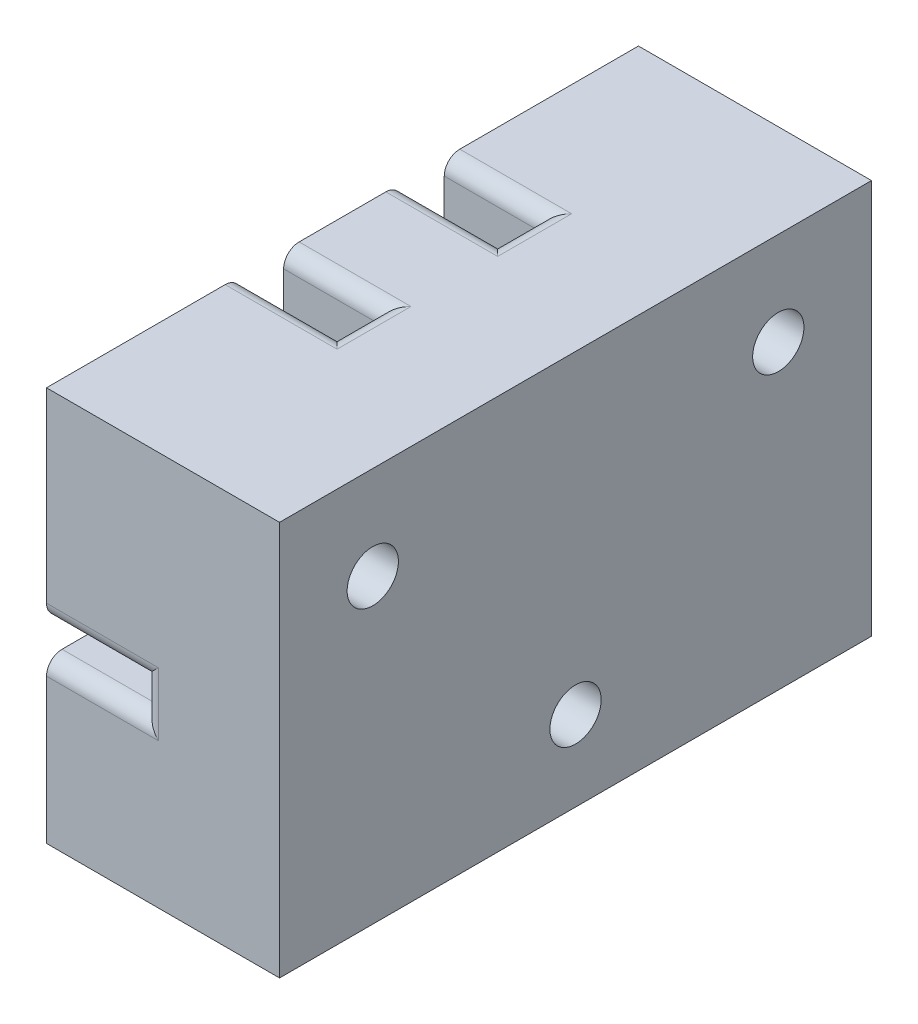
ISO-10303-21;
HEADER;
FILE_DESCRIPTION(('STEP AP214'),'2;1');
FILE_NAME('part.step','',(''),(''),'','','');
FILE_SCHEMA(('AUTOMOTIVE_DESIGN { 1 0 10303 214 1 1 1 1 }'));
ENDSEC;
DATA;
#1=APPLICATION_CONTEXT('core data for automotive mechanical design processes');
#2=APPLICATION_PROTOCOL_DEFINITION('international standard','automotive_design',2000,#1);
#3=PRODUCT_CONTEXT('',#1,'mechanical');
#4=PRODUCT('Part','Part','',(#3));
#5=PRODUCT_RELATED_PRODUCT_CATEGORY('part','',(#4));
#6=PRODUCT_DEFINITION_FORMATION('','',#4);
#7=PRODUCT_DEFINITION_CONTEXT('part definition',#1,'design');
#8=PRODUCT_DEFINITION('design','',#6,#7);
#9=PRODUCT_DEFINITION_SHAPE('','',#8);
#10=(LENGTH_UNIT() NAMED_UNIT(*) SI_UNIT(.MILLI.,.METRE.));
#11=(NAMED_UNIT(*) PLANE_ANGLE_UNIT() SI_UNIT($,.RADIAN.));
#12=(NAMED_UNIT(*) SI_UNIT($,.STERADIAN.) SOLID_ANGLE_UNIT());
#13=UNCERTAINTY_MEASURE_WITH_UNIT(LENGTH_MEASURE(1.E-05),#10,'distance_accuracy_value','');
#14=(GEOMETRIC_REPRESENTATION_CONTEXT(3) GLOBAL_UNCERTAINTY_ASSIGNED_CONTEXT((#13)) GLOBAL_UNIT_ASSIGNED_CONTEXT((#10,
#11,#12)) REPRESENTATION_CONTEXT('',''));
#15=CARTESIAN_POINT('',(0.,0.,0.));
#16=DIRECTION('',(0.,0.,1.));
#17=DIRECTION('',(1.,0.,0.));
#18=AXIS2_PLACEMENT_3D('',#15,#16,#17);
#19=CARTESIAN_POINT('',(0.,0.,0.));
#20=DIRECTION('',(1.,0.,0.));
#21=DIRECTION('',(0.,0.,-1.));
#22=AXIS2_PLACEMENT_3D('',#19,#20,#21);
#23=PLANE('',#22);
#24=CARTESIAN_POINT('',(0.,5.1625,-19.0499999999965));
#25=DIRECTION('',(1.,0.,0.));
#26=DIRECTION('',(0.,0.,-1.));
#27=AXIS2_PLACEMENT_3D('',#24,#25,#26);
#28=CIRCLE('',#27,1.65);
#29=CARTESIAN_POINT('',(0.,5.1625,-20.6999999999965));
#30=VERTEX_POINT('',#29);
#31=EDGE_CURVE('E383',#30,#30,#28,.T.);
#32=ORIENTED_EDGE('',*,*,#31,.T.);
#33=EDGE_LOOP('',(#32));
#34=FACE_BOUND('',#33,.T.);
#35=DIRECTION('',(0.,0.,-1.));
#36=VECTOR('',#35,1.);
#37=CARTESIAN_POINT('',(0.,25.4,0.));
#38=LINE('',#37,#36);
#39=CARTESIAN_POINT('',(0.,25.4,-16.2599999999929));
#40=VERTEX_POINT('',#39);
#41=CARTESIAN_POINT('',(0.,25.4,-21.8400000000071));
#42=VERTEX_POINT('',#41);
#43=EDGE_CURVE('E378',#40,#42,#38,.T.);
#44=ORIENTED_EDGE('',*,*,#43,.T.);
#45=CARTESIAN_POINT('',(0.,24.4,-21.8400000000071));
#46=DIRECTION('',(1.,0.,0.));
#47=DIRECTION('',(0.,0.,-1.));
#48=AXIS2_PLACEMENT_3D('',#45,#46,#47);
#49=CIRCLE('',#48,1.);
#50=CARTESIAN_POINT('',(0.,24.4,-22.8400000000071));
#51=VERTEX_POINT('',#50);
#52=EDGE_CURVE('E505',#42,#51,#49,.F.);
#53=ORIENTED_EDGE('',*,*,#52,.T.);
#54=DIRECTION('',(0.,-1.,0.));
#55=VECTOR('',#54,1.);
#56=CARTESIAN_POINT('',(0.,0.,-22.8400000000071));
#57=LINE('',#56,#55);
#58=CARTESIAN_POINT('',(0.,11.325,-22.8400000000071));
#59=VERTEX_POINT('',#58);
#60=EDGE_CURVE('E630',#51,#59,#57,.T.);
#61=ORIENTED_EDGE('',*,*,#60,.T.);
#62=CARTESIAN_POINT('',(0.,11.325,-23.8400000000071));
#63=DIRECTION('',(1.,0.,0.));
#64=DIRECTION('',(0.,0.,-1.));
#65=AXIS2_PLACEMENT_3D('',#62,#63,#64);
#66=CIRCLE('',#65,1.);
#67=CARTESIAN_POINT('',(0.,10.325,-23.8400000000071));
#68=VERTEX_POINT('',#67);
#69=EDGE_CURVE('E155',#59,#68,#66,.T.);
#70=ORIENTED_EDGE('',*,*,#69,.T.);
#71=DIRECTION('',(0.,0.,-1.));
#72=VECTOR('',#71,1.);
#73=CARTESIAN_POINT('',(0.,10.325,0.));
#74=LINE('',#73,#72);
#75=CARTESIAN_POINT('',(0.,10.325,-37.1));
#76=VERTEX_POINT('',#75);
#77=EDGE_CURVE('E638',#68,#76,#74,.T.);
#78=ORIENTED_EDGE('',*,*,#77,.T.);
#79=CARTESIAN_POINT('',(0.,9.325,-37.1));
#80=DIRECTION('',(1.,0.,0.));
#81=DIRECTION('',(0.,0.,-1.));
#82=AXIS2_PLACEMENT_3D('',#79,#80,#81);
#83=CIRCLE('',#82,1.);
#84=CARTESIAN_POINT('',(0.,9.325,-38.1));
#85=VERTEX_POINT('',#84);
#86=EDGE_CURVE('E491',#76,#85,#83,.F.);
#87=ORIENTED_EDGE('',*,*,#86,.T.);
#88=DIRECTION('',(0.,-1.,0.));
#89=VECTOR('',#88,1.);
#90=CARTESIAN_POINT('',(0.,0.,-38.1));
#91=LINE('',#90,#89);
#92=CARTESIAN_POINT('',(0.,0.,-38.1));
#93=VERTEX_POINT('',#92);
#94=EDGE_CURVE('E397',#85,#93,#91,.T.);
#95=ORIENTED_EDGE('',*,*,#94,.T.);
#96=DIRECTION('',(0.,0.,-1.));
#97=VECTOR('',#96,1.);
#98=CARTESIAN_POINT('',(0.,0.,0.));
#99=LINE('',#98,#97);
#100=CARTESIAN_POINT('',(0.,0.,0.));
#101=VERTEX_POINT('',#100);
#102=EDGE_CURVE('E398',#101,#93,#99,.T.);
#103=ORIENTED_EDGE('',*,*,#102,.F.);
#104=DIRECTION('',(0.,-1.,0.));
#105=VECTOR('',#104,1.);
#106=CARTESIAN_POINT('',(0.,0.,0.));
#107=LINE('',#106,#105);
#108=CARTESIAN_POINT('',(0.,9.325,0.));
#109=VERTEX_POINT('',#108);
#110=EDGE_CURVE('E377',#109,#101,#107,.T.);
#111=ORIENTED_EDGE('',*,*,#110,.F.);
#112=CARTESIAN_POINT('',(0.,9.325,-1.));
#113=DIRECTION('',(1.,0.,0.));
#114=DIRECTION('',(0.,0.,-1.));
#115=AXIS2_PLACEMENT_3D('',#112,#113,#114);
#116=CIRCLE('',#115,1.);
#117=CARTESIAN_POINT('',(0.,10.325,-1.));
#118=VERTEX_POINT('',#117);
#119=EDGE_CURVE('E496',#109,#118,#116,.F.);
#120=ORIENTED_EDGE('',*,*,#119,.T.);
#121=DIRECTION('',(0.,0.,1.));
#122=VECTOR('',#121,1.);
#123=CARTESIAN_POINT('',(0.,10.325,-15.2599999999929));
#124=LINE('',#123,#122);
#125=CARTESIAN_POINT('',(0.,10.325,-14.2599999999929));
#126=VERTEX_POINT('',#125);
#127=EDGE_CURVE('E649',#126,#118,#124,.T.);
#128=ORIENTED_EDGE('',*,*,#127,.F.);
#129=CARTESIAN_POINT('',(0.,11.325,-14.2599999999929));
#130=DIRECTION('',(1.,0.,0.));
#131=DIRECTION('',(0.,0.,-1.));
#132=AXIS2_PLACEMENT_3D('',#129,#130,#131);
#133=CIRCLE('',#132,1.);
#134=CARTESIAN_POINT('',(0.,11.325,-15.2599999999929));
#135=VERTEX_POINT('',#134);
#136=EDGE_CURVE('E557',#126,#135,#133,.T.);
#137=ORIENTED_EDGE('',*,*,#136,.T.);
#138=DIRECTION('',(0.,-1.,0.));
#139=VECTOR('',#138,1.);
#140=CARTESIAN_POINT('',(0.,25.4,-15.2599999999929));
#141=LINE('',#140,#139);
#142=CARTESIAN_POINT('',(0.,24.4,-15.2599999999929));
#143=VERTEX_POINT('',#142);
#144=EDGE_CURVE('E644',#143,#135,#141,.T.);
#145=ORIENTED_EDGE('',*,*,#144,.F.);
#146=CARTESIAN_POINT('',(0.,24.4,-16.2599999999929));
#147=DIRECTION('',(1.,0.,0.));
#148=DIRECTION('',(0.,0.,-1.));
#149=AXIS2_PLACEMENT_3D('',#146,#147,#148);
#150=CIRCLE('',#149,1.);
#151=EDGE_CURVE('E497',#143,#40,#150,.F.);
#152=ORIENTED_EDGE('',*,*,#151,.T.);
#153=EDGE_LOOP('',(#44,#53,#61,#70,#78,#87,#95,#103,#111,#120,#128,#137,#145,#152));
#154=FACE_BOUND('',#153,.T.);
#155=ADVANCED_FACE('F141',(#34,#154),#23,.F.);
#156=CARTESIAN_POINT('',(0.,19.4,-32.1));
#157=DIRECTION('',(1.,0.,0.));
#158=DIRECTION('',(0.,0.,-1.));
#159=AXIS2_PLACEMENT_3D('',#156,#157,#158);
#160=CIRCLE('',#159,1.65);
#161=CARTESIAN_POINT('',(0.,19.4,-33.75));
#162=VERTEX_POINT('',#161);
#163=EDGE_CURVE('E408',#162,#162,#160,.F.);
#164=ORIENTED_EDGE('',*,*,#163,.F.);
#165=EDGE_LOOP('',(#164));
#166=FACE_BOUND('',#165,.T.);
#167=DIRECTION('',(0.,1.,0.));
#168=VECTOR('',#167,1.);
#169=CARTESIAN_POINT('',(0.,0.,-25.6000000000071));
#170=LINE('',#169,#168);
#171=CARTESIAN_POINT('',(0.,13.395,-25.6000000000071));
#172=VERTEX_POINT('',#171);
#173=CARTESIAN_POINT('',(0.,24.4,-25.6000000000071));
#174=VERTEX_POINT('',#173);
#175=EDGE_CURVE('E631',#172,#174,#170,.T.);
#176=ORIENTED_EDGE('',*,*,#175,.T.);
#177=CARTESIAN_POINT('',(0.,24.4,-26.6000000000071));
#178=DIRECTION('',(1.,0.,0.));
#179=DIRECTION('',(0.,0.,-1.));
#180=AXIS2_PLACEMENT_3D('',#177,#178,#179);
#181=CIRCLE('',#180,1.);
#182=CARTESIAN_POINT('',(0.,25.4,-26.6000000000071));
#183=VERTEX_POINT('',#182);
#184=EDGE_CURVE('E489',#174,#183,#181,.F.);
#185=ORIENTED_EDGE('',*,*,#184,.T.);
#186=CARTESIAN_POINT('',(0.,25.4,-38.1));
#187=VERTEX_POINT('',#186);
#188=EDGE_CURVE('E372',#183,#187,#38,.T.);
#189=ORIENTED_EDGE('',*,*,#188,.T.);
#190=CARTESIAN_POINT('',(0.,13.395,-38.1));
#191=VERTEX_POINT('',#190);
#192=EDGE_CURVE('E405',#187,#191,#91,.T.);
#193=ORIENTED_EDGE('',*,*,#192,.T.);
#194=CARTESIAN_POINT('',(0.,13.395,-37.1));
#195=DIRECTION('',(1.,0.,0.));
#196=DIRECTION('',(0.,0.,-1.));
#197=AXIS2_PLACEMENT_3D('',#194,#195,#196);
#198=CIRCLE('',#197,1.);
#199=CARTESIAN_POINT('',(0.,12.395,-37.1));
#200=VERTEX_POINT('',#199);
#201=EDGE_CURVE('E484',#191,#200,#198,.F.);
#202=ORIENTED_EDGE('',*,*,#201,.T.);
#203=DIRECTION('',(0.,0.,1.));
#204=VECTOR('',#203,1.);
#205=CARTESIAN_POINT('',(0.,12.395,0.));
#206=LINE('',#205,#204);
#207=CARTESIAN_POINT('',(0.,12.395,-26.6000000000071));
#208=VERTEX_POINT('',#207);
#209=EDGE_CURVE('E634',#200,#208,#206,.T.);
#210=ORIENTED_EDGE('',*,*,#209,.T.);
#211=CARTESIAN_POINT('',(0.,13.395,-26.6000000000071));
#212=DIRECTION('',(1.,0.,0.));
#213=DIRECTION('',(0.,0.,-1.));
#214=AXIS2_PLACEMENT_3D('',#211,#212,#213);
#215=CIRCLE('',#214,1.);
#216=EDGE_CURVE('E487',#208,#172,#215,.F.);
#217=ORIENTED_EDGE('',*,*,#216,.T.);
#218=EDGE_LOOP('',(#176,#185,#189,#193,#202,#210,#217));
#219=FACE_BOUND('',#218,.T.);
#220=ADVANCED_FACE('F722',(#166,#219),#23,.F.);
#221=CARTESIAN_POINT('',(0.,19.4,-6.));
#222=DIRECTION('',(1.,0.,0.));
#223=DIRECTION('',(0.,0.,-1.));
#224=AXIS2_PLACEMENT_3D('',#221,#222,#223);
#225=CIRCLE('',#224,1.65);
#226=CARTESIAN_POINT('',(0.,19.4,-7.65));
#227=VERTEX_POINT('',#226);
#228=EDGE_CURVE('E369',#227,#227,#225,.T.);
#229=ORIENTED_EDGE('',*,*,#228,.T.);
#230=EDGE_LOOP('',(#229));
#231=FACE_BOUND('',#230,.T.);
#232=CARTESIAN_POINT('',(0.,25.4,0.));
#233=VERTEX_POINT('',#232);
#234=CARTESIAN_POINT('',(0.,25.4,-11.4999999999929));
#235=VERTEX_POINT('',#234);
#236=EDGE_CURVE('E338',#233,#235,#38,.T.);
#237=ORIENTED_EDGE('',*,*,#236,.T.);
#238=CARTESIAN_POINT('',(0.,24.4,-11.4999999999929));
#239=DIRECTION('',(1.,0.,0.));
#240=DIRECTION('',(0.,0.,-1.));
#241=AXIS2_PLACEMENT_3D('',#238,#239,#240);
#242=CIRCLE('',#241,1.);
#243=CARTESIAN_POINT('',(0.,24.4,-12.4999999999929));
#244=VERTEX_POINT('',#243);
#245=EDGE_CURVE('E163',#235,#244,#242,.F.);
#246=ORIENTED_EDGE('',*,*,#245,.T.);
#247=DIRECTION('',(0.,1.,0.));
#248=VECTOR('',#247,1.);
#249=CARTESIAN_POINT('',(0.,12.395,-12.4999999999929));
#250=LINE('',#249,#248);
#251=CARTESIAN_POINT('',(0.,13.395,-12.4999999999929));
#252=VERTEX_POINT('',#251);
#253=EDGE_CURVE('E653',#252,#244,#250,.T.);
#254=ORIENTED_EDGE('',*,*,#253,.F.);
#255=CARTESIAN_POINT('',(0.,13.395,-11.4999999999929));
#256=DIRECTION('',(1.,0.,0.));
#257=DIRECTION('',(0.,0.,-1.));
#258=AXIS2_PLACEMENT_3D('',#255,#256,#257);
#259=CIRCLE('',#258,1.);
#260=CARTESIAN_POINT('',(0.,12.395,-11.4999999999929));
#261=VERTEX_POINT('',#260);
#262=EDGE_CURVE('E169',#252,#261,#259,.F.);
#263=ORIENTED_EDGE('',*,*,#262,.T.);
#264=DIRECTION('',(0.,0.,-1.));
#265=VECTOR('',#264,1.);
#266=CARTESIAN_POINT('',(0.,12.395,7.105427357601E-12));
#267=LINE('',#266,#265);
#268=CARTESIAN_POINT('',(0.,12.395,-1.));
#269=VERTEX_POINT('',#268);
#270=EDGE_CURVE('E646',#269,#261,#267,.T.);
#271=ORIENTED_EDGE('',*,*,#270,.F.);
#272=CARTESIAN_POINT('',(0.,13.395,-1.));
#273=DIRECTION('',(1.,0.,0.));
#274=DIRECTION('',(0.,0.,-1.));
#275=AXIS2_PLACEMENT_3D('',#272,#273,#274);
#276=CIRCLE('',#275,1.);
#277=CARTESIAN_POINT('',(0.,13.395,0.));
#278=VERTEX_POINT('',#277);
#279=EDGE_CURVE('E511',#269,#278,#276,.F.);
#280=ORIENTED_EDGE('',*,*,#279,.T.);
#281=EDGE_CURVE('E366',#233,#278,#107,.T.);
#282=ORIENTED_EDGE('',*,*,#281,.F.);
#283=EDGE_LOOP('',(#237,#246,#254,#263,#271,#280,#282));
#284=FACE_BOUND('',#283,.T.);
#285=ADVANCED_FACE('F708',(#231,#284),#23,.F.);
#286=CARTESIAN_POINT('',(15.,25.4,0.));
#287=DIRECTION('',(0.,1.,0.));
#288=DIRECTION('',(0.,0.,1.));
#289=AXIS2_PLACEMENT_3D('',#286,#287,#288);
#290=PLANE('',#289);
#291=ORIENTED_EDGE('',*,*,#188,.F.);
#292=DIRECTION('',(-1.,0.,0.));
#293=VECTOR('',#292,1.);
#294=CARTESIAN_POINT('',(15.,25.4,-26.6000000000071));
#295=LINE('',#294,#293);
#296=CARTESIAN_POINT('',(7.2,25.4,-26.6000000000071));
#297=VERTEX_POINT('',#296);
#298=EDGE_CURVE('E436',#183,#297,#295,.F.);
#299=ORIENTED_EDGE('',*,*,#298,.T.);
#300=DIRECTION('',(0.,0.,1.));
#301=VECTOR('',#300,1.);
#302=CARTESIAN_POINT('',(7.2,25.4,-22.8400000000071));
#303=LINE('',#302,#301);
#304=CARTESIAN_POINT('',(7.2,25.4,-21.8400000000071));
#305=VERTEX_POINT('',#304);
#306=EDGE_CURVE('E435',#297,#305,#303,.T.);
#307=ORIENTED_EDGE('',*,*,#306,.T.);
#308=DIRECTION('',(-1.,0.,0.));
#309=VECTOR('',#308,1.);
#310=CARTESIAN_POINT('',(15.,25.4,-21.8400000000071));
#311=LINE('',#310,#309);
#312=EDGE_CURVE('E429',#305,#42,#311,.T.);
#313=ORIENTED_EDGE('',*,*,#312,.T.);
#314=ORIENTED_EDGE('',*,*,#43,.F.);
#315=DIRECTION('',(-1.,0.,0.));
#316=VECTOR('',#315,1.);
#317=CARTESIAN_POINT('',(6.2,25.4,-16.2599999999929));
#318=LINE('',#317,#316);
#319=CARTESIAN_POINT('',(7.2,25.4,-16.2599999999929));
#320=VERTEX_POINT('',#319);
#321=EDGE_CURVE('E341',#40,#320,#318,.F.);
#322=ORIENTED_EDGE('',*,*,#321,.T.);
#323=DIRECTION('',(0.,0.,-1.));
#324=VECTOR('',#323,1.);
#325=CARTESIAN_POINT('',(7.2,25.4,0.));
#326=LINE('',#325,#324);
#327=CARTESIAN_POINT('',(7.2,25.4,-11.4999999999929));
#328=VERTEX_POINT('',#327);
#329=EDGE_CURVE('E421',#320,#328,#326,.F.);
#330=ORIENTED_EDGE('',*,*,#329,.T.);
#331=DIRECTION('',(-1.,0.,0.));
#332=VECTOR('',#331,1.);
#333=CARTESIAN_POINT('',(0.,25.4,-11.4999999999929));
#334=LINE('',#333,#332);
#335=EDGE_CURVE('E428',#328,#235,#334,.T.);
#336=ORIENTED_EDGE('',*,*,#335,.T.);
#337=ORIENTED_EDGE('',*,*,#236,.F.);
#338=DIRECTION('',(-1.,0.,0.));
#339=VECTOR('',#338,1.);
#340=CARTESIAN_POINT('',(15.,25.4,0.));
#341=LINE('',#340,#339);
#342=CARTESIAN_POINT('',(15.,25.4,0.));
#343=VERTEX_POINT('',#342);
#344=EDGE_CURVE('E335',#343,#233,#341,.T.);
#345=ORIENTED_EDGE('',*,*,#344,.F.);
#346=DIRECTION('',(0.,0.,-1.));
#347=VECTOR('',#346,1.);
#348=CARTESIAN_POINT('',(15.,25.4,0.));
#349=LINE('',#348,#347);
#350=CARTESIAN_POINT('',(15.,25.4,-38.1));
#351=VERTEX_POINT('',#350);
#352=EDGE_CURVE('E336',#343,#351,#349,.T.);
#353=ORIENTED_EDGE('',*,*,#352,.T.);
#354=DIRECTION('',(-1.,0.,0.));
#355=VECTOR('',#354,1.);
#356=CARTESIAN_POINT('',(15.,25.4,-38.1));
#357=LINE('',#356,#355);
#358=EDGE_CURVE('E412',#351,#187,#357,.T.);
#359=ORIENTED_EDGE('',*,*,#358,.T.);
#360=EDGE_LOOP('',(#291,#299,#307,#313,#314,#322,#330,#336,#337,#345,#353,#359));
#361=FACE_BOUND('',#360,.T.);
#362=ADVANCED_FACE('F332',(#361),#290,.T.);
#363=CARTESIAN_POINT('',(15.,0.,-38.1));
#364=DIRECTION('',(0.,0.,-1.));
#365=DIRECTION('',(-1.,0.,0.));
#366=AXIS2_PLACEMENT_3D('',#363,#364,#365);
#367=PLANE('',#366);
#368=ORIENTED_EDGE('',*,*,#94,.F.);
#369=DIRECTION('',(-1.,0.,0.));
#370=VECTOR('',#369,1.);
#371=CARTESIAN_POINT('',(15.,9.325,-38.1));
#372=LINE('',#371,#370);
#373=CARTESIAN_POINT('',(7.2,9.325,-38.1));
#374=VERTEX_POINT('',#373);
#375=EDGE_CURVE('E467',#85,#374,#372,.F.);
#376=ORIENTED_EDGE('',*,*,#375,.T.);
#377=DIRECTION('',(0.,1.,0.));
#378=VECTOR('',#377,1.);
#379=CARTESIAN_POINT('',(7.2,12.395,-38.1));
#380=LINE('',#379,#378);
#381=CARTESIAN_POINT('',(7.2,13.395,-38.1));
#382=VERTEX_POINT('',#381);
#383=EDGE_CURVE('E465',#374,#382,#380,.T.);
#384=ORIENTED_EDGE('',*,*,#383,.T.);
#385=DIRECTION('',(-1.,0.,0.));
#386=VECTOR('',#385,1.);
#387=CARTESIAN_POINT('',(15.,13.395,-38.1));
#388=LINE('',#387,#386);
#389=EDGE_CURVE('E458',#382,#191,#388,.T.);
#390=ORIENTED_EDGE('',*,*,#389,.T.);
#391=ORIENTED_EDGE('',*,*,#192,.F.);
#392=ORIENTED_EDGE('',*,*,#358,.F.);
#393=DIRECTION('',(0.,-1.,0.));
#394=VECTOR('',#393,1.);
#395=CARTESIAN_POINT('',(15.,0.,-38.1));
#396=LINE('',#395,#394);
#397=CARTESIAN_POINT('',(15.,0.,-38.1));
#398=VERTEX_POINT('',#397);
#399=EDGE_CURVE('E359',#351,#398,#396,.T.);
#400=ORIENTED_EDGE('',*,*,#399,.T.);
#401=DIRECTION('',(-1.,0.,0.));
#402=VECTOR('',#401,1.);
#403=CARTESIAN_POINT('',(15.,0.,-38.1));
#404=LINE('',#403,#402);
#405=EDGE_CURVE('E374',#398,#93,#404,.T.);
#406=ORIENTED_EDGE('',*,*,#405,.T.);
#407=EDGE_LOOP('',(#368,#376,#384,#390,#391,#392,#400,#406));
#408=FACE_BOUND('',#407,.T.);
#409=ADVANCED_FACE('F737',(#408),#367,.T.);
#410=CARTESIAN_POINT('',(15.,0.,0.));
#411=DIRECTION('',(0.,0.,-1.));
#412=DIRECTION('',(-1.,0.,0.));
#413=AXIS2_PLACEMENT_3D('',#410,#411,#412);
#414=PLANE('',#413);
#415=DIRECTION('',(0.,1.,0.));
#416=VECTOR('',#415,1.);
#417=CARTESIAN_POINT('',(7.2,10.325,0.));
#418=LINE('',#417,#416);
#419=CARTESIAN_POINT('',(7.2,13.395,0.));
#420=VERTEX_POINT('',#419);
#421=CARTESIAN_POINT('',(7.2,9.325,0.));
#422=VERTEX_POINT('',#421);
#423=EDGE_CURVE('E474',#420,#422,#418,.F.);
#424=ORIENTED_EDGE('',*,*,#423,.T.);
#425=DIRECTION('',(-1.,0.,0.));
#426=VECTOR('',#425,1.);
#427=CARTESIAN_POINT('',(15.,9.325,0.));
#428=LINE('',#427,#426);
#429=EDGE_CURVE('E471',#422,#109,#428,.T.);
#430=ORIENTED_EDGE('',*,*,#429,.T.);
#431=ORIENTED_EDGE('',*,*,#110,.T.);
#432=DIRECTION('',(-1.,0.,0.));
#433=VECTOR('',#432,1.);
#434=CARTESIAN_POINT('',(15.,0.,0.));
#435=LINE('',#434,#433);
#436=CARTESIAN_POINT('',(15.,0.,0.));
#437=VERTEX_POINT('',#436);
#438=EDGE_CURVE('E353',#437,#101,#435,.T.);
#439=ORIENTED_EDGE('',*,*,#438,.F.);
#440=DIRECTION('',(0.,-1.,0.));
#441=VECTOR('',#440,1.);
#442=CARTESIAN_POINT('',(15.,0.,0.));
#443=LINE('',#442,#441);
#444=EDGE_CURVE('E349',#343,#437,#443,.T.);
#445=ORIENTED_EDGE('',*,*,#444,.F.);
#446=ORIENTED_EDGE('',*,*,#344,.T.);
#447=ORIENTED_EDGE('',*,*,#281,.T.);
#448=DIRECTION('',(-1.,0.,0.));
#449=VECTOR('',#448,1.);
#450=CARTESIAN_POINT('',(15.,13.395,0.));
#451=LINE('',#450,#449);
#452=EDGE_CURVE('E469',#278,#420,#451,.F.);
#453=ORIENTED_EDGE('',*,*,#452,.T.);
#454=EDGE_LOOP('',(#424,#430,#431,#439,#445,#446,#447,#453));
#455=FACE_BOUND('',#454,.T.);
#456=ADVANCED_FACE('F348',(#455),#414,.F.);
#457=CARTESIAN_POINT('',(15.,19.4,-6.));
#458=DIRECTION('',(-1.,0.,0.));
#459=DIRECTION('',(0.,0.,1.));
#460=AXIS2_PLACEMENT_3D('',#457,#458,#459);
#461=CYLINDRICAL_SURFACE('',#460,1.65);
#462=CARTESIAN_POINT('',(15.,19.4,-6.));
#463=DIRECTION('',(1.,0.,0.));
#464=DIRECTION('',(0.,0.,-1.));
#465=AXIS2_PLACEMENT_3D('',#462,#463,#464);
#466=CIRCLE('',#465,1.65);
#467=CARTESIAN_POINT('',(15.,19.4,-7.65));
#468=VERTEX_POINT('',#467);
#469=EDGE_CURVE('E365',#468,#468,#466,.T.);
#470=ORIENTED_EDGE('',*,*,#469,.T.);
#471=EDGE_LOOP('',(#470));
#472=FACE_BOUND('',#471,.T.);
#473=ORIENTED_EDGE('',*,*,#228,.F.);
#474=EDGE_LOOP('',(#473));
#475=FACE_BOUND('',#474,.T.);
#476=ADVANCED_FACE('F744',(#472,#475),#461,.F.);
#477=CARTESIAN_POINT('',(15.,0.,0.));
#478=DIRECTION('',(1.,0.,0.));
#479=DIRECTION('',(0.,0.,-1.));
#480=AXIS2_PLACEMENT_3D('',#477,#478,#479);
#481=PLANE('',#480);
#482=ORIENTED_EDGE('',*,*,#469,.F.);
#483=EDGE_LOOP('',(#482));
#484=FACE_BOUND('',#483,.T.);
#485=ORIENTED_EDGE('',*,*,#352,.F.);
#486=ORIENTED_EDGE('',*,*,#444,.T.);
#487=DIRECTION('',(0.,0.,-1.));
#488=VECTOR('',#487,1.);
#489=CARTESIAN_POINT('',(15.,0.,0.));
#490=LINE('',#489,#488);
#491=EDGE_CURVE('E385',#437,#398,#490,.T.);
#492=ORIENTED_EDGE('',*,*,#491,.T.);
#493=ORIENTED_EDGE('',*,*,#399,.F.);
#494=EDGE_LOOP('',(#485,#486,#492,#493));
#495=FACE_BOUND('',#494,.T.);
#496=CARTESIAN_POINT('',(15.,19.4,-32.1));
#497=DIRECTION('',(1.,0.,0.));
#498=DIRECTION('',(0.,0.,-1.));
#499=AXIS2_PLACEMENT_3D('',#496,#497,#498);
#500=CIRCLE('',#499,1.65);
#501=CARTESIAN_POINT('',(15.,19.4,-33.75));
#502=VERTEX_POINT('',#501);
#503=EDGE_CURVE('E387',#502,#502,#500,.F.);
#504=ORIENTED_EDGE('',*,*,#503,.T.);
#505=EDGE_LOOP('',(#504));
#506=FACE_BOUND('',#505,.T.);
#507=CARTESIAN_POINT('',(15.,5.1625,-19.0499999999965));
#508=DIRECTION('',(1.,0.,0.));
#509=DIRECTION('',(0.,0.,-1.));
#510=AXIS2_PLACEMENT_3D('',#507,#508,#509);
#511=CIRCLE('',#510,1.65);
#512=CARTESIAN_POINT('',(15.,5.1625,-20.6999999999965));
#513=VERTEX_POINT('',#512);
#514=EDGE_CURVE('E391',#513,#513,#511,.T.);
#515=ORIENTED_EDGE('',*,*,#514,.F.);
#516=EDGE_LOOP('',(#515));
#517=FACE_BOUND('',#516,.T.);
#518=ADVANCED_FACE('F357',(#484,#495,#506,#517),#481,.T.);
#519=CARTESIAN_POINT('',(15.,5.1625,-19.0499999999965));
#520=DIRECTION('',(-1.,0.,0.));
#521=DIRECTION('',(0.,0.,1.));
#522=AXIS2_PLACEMENT_3D('',#519,#520,#521);
#523=CYLINDRICAL_SURFACE('',#522,1.65);
#524=ORIENTED_EDGE('',*,*,#514,.T.);
#525=EDGE_LOOP('',(#524));
#526=FACE_BOUND('',#525,.T.);
#527=ORIENTED_EDGE('',*,*,#31,.F.);
#528=EDGE_LOOP('',(#527));
#529=FACE_BOUND('',#528,.T.);
#530=ADVANCED_FACE('F753',(#526,#529),#523,.F.);
#531=CARTESIAN_POINT('',(15.,19.4,-32.1));
#532=DIRECTION('',(-1.,0.,0.));
#533=DIRECTION('',(0.,0.,1.));
#534=AXIS2_PLACEMENT_3D('',#531,#532,#533);
#535=CYLINDRICAL_SURFACE('',#534,1.65);
#536=ORIENTED_EDGE('',*,*,#503,.F.);
#537=EDGE_LOOP('',(#536));
#538=FACE_BOUND('',#537,.T.);
#539=ORIENTED_EDGE('',*,*,#163,.T.);
#540=EDGE_LOOP('',(#539));
#541=FACE_BOUND('',#540,.T.);
#542=ADVANCED_FACE('F757',(#538,#541),#535,.F.);
#543=CARTESIAN_POINT('',(15.,0.,0.));
#544=DIRECTION('',(0.,1.,0.));
#545=DIRECTION('',(0.,0.,1.));
#546=AXIS2_PLACEMENT_3D('',#543,#544,#545);
#547=PLANE('',#546);
#548=ORIENTED_EDGE('',*,*,#102,.T.);
#549=ORIENTED_EDGE('',*,*,#405,.F.);
#550=ORIENTED_EDGE('',*,*,#491,.F.);
#551=ORIENTED_EDGE('',*,*,#438,.T.);
#552=EDGE_LOOP('',(#548,#549,#550,#551));
#553=FACE_BOUND('',#552,.T.);
#554=ADVANCED_FACE('F752',(#553),#547,.F.);
#555=CARTESIAN_POINT('',(6.2,10.325,0.));
#556=DIRECTION('',(0.,1.,0.));
#557=DIRECTION('',(0.,0.,1.));
#558=AXIS2_PLACEMENT_3D('',#555,#556,#557);
#559=PLANE('',#558);
#560=ORIENTED_EDGE('',*,*,#77,.F.);
#561=DIRECTION('',(-1.,0.,0.));
#562=VECTOR('',#561,1.);
#563=CARTESIAN_POINT('',(6.2,10.325,-23.8400000000071));
#564=LINE('',#563,#562);
#565=CARTESIAN_POINT('',(6.2,10.325,-23.8400000000071));
#566=VERTEX_POINT('',#565);
#567=EDGE_CURVE('E550',#68,#566,#564,.F.);
#568=ORIENTED_EDGE('',*,*,#567,.T.);
#569=DIRECTION('',(0.,0.,-1.));
#570=VECTOR('',#569,1.);
#571=CARTESIAN_POINT('',(6.2,10.325,0.));
#572=LINE('',#571,#570);
#573=CARTESIAN_POINT('',(6.2,10.325,-37.1));
#574=VERTEX_POINT('',#573);
#575=EDGE_CURVE('E621',#566,#574,#572,.T.);
#576=ORIENTED_EDGE('',*,*,#575,.T.);
#577=DIRECTION('',(-1.,0.,0.));
#578=VECTOR('',#577,1.);
#579=CARTESIAN_POINT('',(6.2,10.325,-37.1));
#580=LINE('',#579,#578);
#581=EDGE_CURVE('E543',#574,#76,#580,.T.);
#582=ORIENTED_EDGE('',*,*,#581,.T.);
#583=EDGE_LOOP('',(#560,#568,#576,#582));
#584=FACE_BOUND('',#583,.T.);
#585=ADVANCED_FACE('F751',(#584),#559,.T.);
#586=CARTESIAN_POINT('',(6.2,12.395,0.));
#587=DIRECTION('',(0.,-1.,0.));
#588=DIRECTION('',(0.,0.,-1.));
#589=AXIS2_PLACEMENT_3D('',#586,#587,#588);
#590=PLANE('',#589);
#591=DIRECTION('',(0.,0.,1.));
#592=VECTOR('',#591,1.);
#593=CARTESIAN_POINT('',(6.2,12.395,0.));
#594=LINE('',#593,#592);
#595=CARTESIAN_POINT('',(6.2,12.395,-37.1));
#596=VERTEX_POINT('',#595);
#597=CARTESIAN_POINT('',(6.2,12.395,-26.6000000000071));
#598=VERTEX_POINT('',#597);
#599=EDGE_CURVE('E620',#596,#598,#594,.T.);
#600=ORIENTED_EDGE('',*,*,#599,.T.);
#601=DIRECTION('',(-1.,0.,0.));
#602=VECTOR('',#601,1.);
#603=CARTESIAN_POINT('',(6.2,12.395,-26.6000000000071));
#604=LINE('',#603,#602);
#605=EDGE_CURVE('E551',#598,#208,#604,.T.);
#606=ORIENTED_EDGE('',*,*,#605,.T.);
#607=ORIENTED_EDGE('',*,*,#209,.F.);
#608=DIRECTION('',(-1.,0.,0.));
#609=VECTOR('',#608,1.);
#610=CARTESIAN_POINT('',(6.2,12.395,-37.1));
#611=LINE('',#610,#609);
#612=EDGE_CURVE('E547',#200,#596,#611,.F.);
#613=ORIENTED_EDGE('',*,*,#612,.T.);
#614=EDGE_LOOP('',(#600,#606,#607,#613));
#615=FACE_BOUND('',#614,.T.);
#616=ADVANCED_FACE('F832',(#615),#590,.T.);
#617=CARTESIAN_POINT('',(6.2,0.,-25.6000000000071));
#618=DIRECTION('',(0.,0.,1.));
#619=DIRECTION('',(0.,-1.,0.));
#620=AXIS2_PLACEMENT_3D('',#617,#618,#619);
#621=PLANE('',#620);
#622=DIRECTION('',(0.,1.,0.));
#623=VECTOR('',#622,1.);
#624=CARTESIAN_POINT('',(6.2,0.,-25.6000000000071));
#625=LINE('',#624,#623);
#626=CARTESIAN_POINT('',(6.2,13.395,-25.6000000000071));
#627=VERTEX_POINT('',#626);
#628=CARTESIAN_POINT('',(6.2,24.4,-25.6000000000071));
#629=VERTEX_POINT('',#628);
#630=EDGE_CURVE('E612',#627,#629,#625,.T.);
#631=ORIENTED_EDGE('',*,*,#630,.T.);
#632=DIRECTION('',(-1.,0.,0.));
#633=VECTOR('',#632,1.);
#634=CARTESIAN_POINT('',(6.2,24.4,-25.6000000000071));
#635=LINE('',#634,#633);
#636=EDGE_CURVE('E483',#629,#174,#635,.T.);
#637=ORIENTED_EDGE('',*,*,#636,.T.);
#638=ORIENTED_EDGE('',*,*,#175,.F.);
#639=DIRECTION('',(-1.,0.,0.));
#640=VECTOR('',#639,1.);
#641=CARTESIAN_POINT('',(6.2,13.395,-25.6000000000071));
#642=LINE('',#641,#640);
#643=EDGE_CURVE('E480',#172,#627,#642,.F.);
#644=ORIENTED_EDGE('',*,*,#643,.T.);
#645=EDGE_LOOP('',(#631,#637,#638,#644));
#646=FACE_BOUND('',#645,.T.);
#647=ADVANCED_FACE('F839',(#646),#621,.T.);
#648=CARTESIAN_POINT('',(6.2,0.,-22.8400000000071));
#649=DIRECTION('',(0.,0.,-1.));
#650=DIRECTION('',(0.,1.,0.));
#651=AXIS2_PLACEMENT_3D('',#648,#649,#650);
#652=PLANE('',#651);
#653=ORIENTED_EDGE('',*,*,#60,.F.);
#654=DIRECTION('',(-1.,0.,0.));
#655=VECTOR('',#654,1.);
#656=CARTESIAN_POINT('',(6.2,24.4,-22.8400000000071));
#657=LINE('',#656,#655);
#658=CARTESIAN_POINT('',(6.2,24.4,-22.8400000000071));
#659=VERTEX_POINT('',#658);
#660=EDGE_CURVE('E508',#51,#659,#657,.F.);
#661=ORIENTED_EDGE('',*,*,#660,.T.);
#662=DIRECTION('',(0.,-1.,0.));
#663=VECTOR('',#662,1.);
#664=CARTESIAN_POINT('',(6.2,0.,-22.8400000000071));
#665=LINE('',#664,#663);
#666=CARTESIAN_POINT('',(6.2,11.325,-22.8400000000071));
#667=VERTEX_POINT('',#666);
#668=EDGE_CURVE('E402',#659,#667,#665,.T.);
#669=ORIENTED_EDGE('',*,*,#668,.T.);
#670=DIRECTION('',(-1.,0.,0.));
#671=VECTOR('',#670,1.);
#672=CARTESIAN_POINT('',(0.,11.325,-22.8400000000071));
#673=LINE('',#672,#671);
#674=EDGE_CURVE('E504',#667,#59,#673,.T.);
#675=ORIENTED_EDGE('',*,*,#674,.T.);
#676=EDGE_LOOP('',(#653,#661,#669,#675));
#677=FACE_BOUND('',#676,.T.);
#678=ADVANCED_FACE('F821',(#677),#652,.T.);
#679=CARTESIAN_POINT('',(6.2,0.,0.));
#680=DIRECTION('',(1.,0.,0.));
#681=DIRECTION('',(0.,0.,-1.));
#682=AXIS2_PLACEMENT_3D('',#679,#680,#681);
#683=PLANE('',#682);
#684=ORIENTED_EDGE('',*,*,#668,.F.);
#685=DIRECTION('',(0.,0.,1.));
#686=VECTOR('',#685,1.);
#687=CARTESIAN_POINT('',(6.2,24.4,-25.6000000000071));
#688=LINE('',#687,#686);
#689=EDGE_CURVE('E444',#659,#629,#688,.F.);
#690=ORIENTED_EDGE('',*,*,#689,.T.);
#691=ORIENTED_EDGE('',*,*,#630,.F.);
#692=CARTESIAN_POINT('',(6.2,13.395,-26.6000000000071));
#693=DIRECTION('',(1.,0.,0.));
#694=DIRECTION('',(0.,0.,-1.));
#695=AXIS2_PLACEMENT_3D('',#692,#693,#694);
#696=CIRCLE('',#695,1.);
#697=EDGE_CURVE('E12',#627,#598,#696,.T.);
#698=ORIENTED_EDGE('',*,*,#697,.T.);
#699=ORIENTED_EDGE('',*,*,#599,.F.);
#700=DIRECTION('',(0.,1.,0.));
#701=VECTOR('',#700,1.);
#702=CARTESIAN_POINT('',(6.2,10.325,-37.1));
#703=LINE('',#702,#701);
#704=EDGE_CURVE('E445',#596,#574,#703,.F.);
#705=ORIENTED_EDGE('',*,*,#704,.T.);
#706=ORIENTED_EDGE('',*,*,#575,.F.);
#707=CARTESIAN_POINT('',(6.2,11.325,-23.8400000000071));
#708=DIRECTION('',(1.,0.,0.));
#709=DIRECTION('',(0.,0.,-1.));
#710=AXIS2_PLACEMENT_3D('',#707,#708,#709);
#711=CIRCLE('',#710,1.);
#712=EDGE_CURVE('E437',#566,#667,#711,.F.);
#713=ORIENTED_EDGE('',*,*,#712,.T.);
#714=EDGE_LOOP('',(#684,#690,#691,#698,#699,#705,#706,#713));
#715=FACE_BOUND('',#714,.T.);
#716=ADVANCED_FACE('F822',(#715),#683,.F.);
#717=CARTESIAN_POINT('',(6.2,12.395,-12.4999999999929));
#718=DIRECTION('',(0.,0.,1.));
#719=DIRECTION('',(0.,-1.,0.));
#720=AXIS2_PLACEMENT_3D('',#717,#718,#719);
#721=PLANE('',#720);
#722=ORIENTED_EDGE('',*,*,#253,.T.);
#723=DIRECTION('',(-1.,0.,0.));
#724=VECTOR('',#723,1.);
#725=CARTESIAN_POINT('',(6.2,24.4,-12.4999999999929));
#726=LINE('',#725,#724);
#727=CARTESIAN_POINT('',(6.2,24.4,-12.4999999999929));
#728=VERTEX_POINT('',#727);
#729=EDGE_CURVE('E521',#244,#728,#726,.F.);
#730=ORIENTED_EDGE('',*,*,#729,.T.);
#731=DIRECTION('',(0.,1.,0.));
#732=VECTOR('',#731,1.);
#733=CARTESIAN_POINT('',(6.2,12.395,-12.4999999999929));
#734=LINE('',#733,#732);
#735=CARTESIAN_POINT('',(6.2,13.395,-12.4999999999929));
#736=VERTEX_POINT('',#735);
#737=EDGE_CURVE('E572',#736,#728,#734,.T.);
#738=ORIENTED_EDGE('',*,*,#737,.F.);
#739=DIRECTION('',(-1.,0.,0.));
#740=VECTOR('',#739,1.);
#741=CARTESIAN_POINT('',(6.2,13.395,-12.4999999999929));
#742=LINE('',#741,#740);
#743=EDGE_CURVE('E520',#736,#252,#742,.T.);
#744=ORIENTED_EDGE('',*,*,#743,.T.);
#745=EDGE_LOOP('',(#722,#730,#738,#744));
#746=FACE_BOUND('',#745,.T.);
#747=ADVANCED_FACE('F706',(#746),#721,.F.);
#748=CARTESIAN_POINT('',(6.2,12.395,7.105427357601E-12));
#749=DIRECTION('',(0.,1.,0.));
#750=DIRECTION('',(0.,0.,1.));
#751=AXIS2_PLACEMENT_3D('',#748,#749,#750);
#752=PLANE('',#751);
#753=DIRECTION('',(0.,0.,-1.));
#754=VECTOR('',#753,1.);
#755=CARTESIAN_POINT('',(6.2,12.395,7.105427357601E-12));
#756=LINE('',#755,#754);
#757=CARTESIAN_POINT('',(6.2,12.395,-1.));
#758=VERTEX_POINT('',#757);
#759=CARTESIAN_POINT('',(6.2,12.395,-11.4999999999929));
#760=VERTEX_POINT('',#759);
#761=EDGE_CURVE('E664',#758,#760,#756,.T.);
#762=ORIENTED_EDGE('',*,*,#761,.F.);
#763=DIRECTION('',(-1.,0.,0.));
#764=VECTOR('',#763,1.);
#765=CARTESIAN_POINT('',(6.2,12.395,-1.));
#766=LINE('',#765,#764);
#767=EDGE_CURVE('E544',#758,#269,#766,.T.);
#768=ORIENTED_EDGE('',*,*,#767,.T.);
#769=ORIENTED_EDGE('',*,*,#270,.T.);
#770=DIRECTION('',(-1.,0.,0.));
#771=VECTOR('',#770,1.);
#772=CARTESIAN_POINT('',(6.2,12.395,-11.4999999999929));
#773=LINE('',#772,#771);
#774=EDGE_CURVE('E537',#261,#760,#773,.F.);
#775=ORIENTED_EDGE('',*,*,#774,.T.);
#776=EDGE_LOOP('',(#762,#768,#769,#775));
#777=FACE_BOUND('',#776,.T.);
#778=ADVANCED_FACE('F707',(#777),#752,.F.);
#779=CARTESIAN_POINT('',(6.2,10.325,-15.2599999999929));
#780=DIRECTION('',(0.,-1.,0.));
#781=DIRECTION('',(0.,0.,-1.));
#782=AXIS2_PLACEMENT_3D('',#779,#780,#781);
#783=PLANE('',#782);
#784=ORIENTED_EDGE('',*,*,#127,.T.);
#785=DIRECTION('',(-1.,0.,0.));
#786=VECTOR('',#785,1.);
#787=CARTESIAN_POINT('',(6.2,10.325,-0.999999999999999));
#788=LINE('',#787,#786);
#789=CARTESIAN_POINT('',(6.2,10.325,-1.));
#790=VERTEX_POINT('',#789);
#791=EDGE_CURVE('E533',#118,#790,#788,.F.);
#792=ORIENTED_EDGE('',*,*,#791,.T.);
#793=DIRECTION('',(0.,0.,1.));
#794=VECTOR('',#793,1.);
#795=CARTESIAN_POINT('',(6.2,10.325,-15.2599999999929));
#796=LINE('',#795,#794);
#797=CARTESIAN_POINT('',(6.2,10.325,-14.2599999999929));
#798=VERTEX_POINT('',#797);
#799=EDGE_CURVE('E662',#798,#790,#796,.T.);
#800=ORIENTED_EDGE('',*,*,#799,.F.);
#801=DIRECTION('',(-1.,0.,0.));
#802=VECTOR('',#801,1.);
#803=CARTESIAN_POINT('',(0.,10.325,-14.2599999999929));
#804=LINE('',#803,#802);
#805=EDGE_CURVE('E532',#798,#126,#804,.T.);
#806=ORIENTED_EDGE('',*,*,#805,.T.);
#807=EDGE_LOOP('',(#784,#792,#800,#806));
#808=FACE_BOUND('',#807,.T.);
#809=ADVANCED_FACE('F702',(#808),#783,.F.);
#810=CARTESIAN_POINT('',(6.2,25.4,-15.2599999999929));
#811=DIRECTION('',(0.,0.,-1.));
#812=DIRECTION('',(0.,1.,0.));
#813=AXIS2_PLACEMENT_3D('',#810,#811,#812);
#814=PLANE('',#813);
#815=DIRECTION('',(0.,-1.,0.));
#816=VECTOR('',#815,1.);
#817=CARTESIAN_POINT('',(6.2,25.4,-15.2599999999929));
#818=LINE('',#817,#816);
#819=CARTESIAN_POINT('',(6.2,24.4,-15.2599999999929));
#820=VERTEX_POINT('',#819);
#821=CARTESIAN_POINT('',(6.2,11.325,-15.2599999999929));
#822=VERTEX_POINT('',#821);
#823=EDGE_CURVE('E660',#820,#822,#818,.T.);
#824=ORIENTED_EDGE('',*,*,#823,.F.);
#825=DIRECTION('',(-1.,0.,0.));
#826=VECTOR('',#825,1.);
#827=CARTESIAN_POINT('',(0.,24.4,-15.2599999999929));
#828=LINE('',#827,#826);
#829=EDGE_CURVE('E526',#820,#143,#828,.T.);
#830=ORIENTED_EDGE('',*,*,#829,.T.);
#831=ORIENTED_EDGE('',*,*,#144,.T.);
#832=DIRECTION('',(-1.,0.,0.));
#833=VECTOR('',#832,1.);
#834=CARTESIAN_POINT('',(6.2,11.325,-15.2599999999929));
#835=LINE('',#834,#833);
#836=EDGE_CURVE('E522',#135,#822,#835,.F.);
#837=ORIENTED_EDGE('',*,*,#836,.T.);
#838=EDGE_LOOP('',(#824,#830,#831,#837));
#839=FACE_BOUND('',#838,.T.);
#840=ADVANCED_FACE('F692',(#839),#814,.F.);
#841=CARTESIAN_POINT('',(6.2,0.,0.));
#842=DIRECTION('',(-1.,0.,0.));
#843=DIRECTION('',(0.,0.,1.));
#844=AXIS2_PLACEMENT_3D('',#841,#842,#843);
#845=PLANE('',#844);
#846=ORIENTED_EDGE('',*,*,#737,.T.);
#847=DIRECTION('',(0.,0.,-1.));
#848=VECTOR('',#847,1.);
#849=CARTESIAN_POINT('',(6.2,24.4,0.));
#850=LINE('',#849,#848);
#851=EDGE_CURVE('E451',#728,#820,#850,.T.);
#852=ORIENTED_EDGE('',*,*,#851,.T.);
#853=ORIENTED_EDGE('',*,*,#823,.T.);
#854=CARTESIAN_POINT('',(6.2,11.325,-14.2599999999929));
#855=DIRECTION('',(-1.,0.,0.));
#856=DIRECTION('',(0.,0.,1.));
#857=AXIS2_PLACEMENT_3D('',#854,#855,#856);
#858=CIRCLE('',#857,1.);
#859=EDGE_CURVE('E449',#822,#798,#858,.T.);
#860=ORIENTED_EDGE('',*,*,#859,.T.);
#861=ORIENTED_EDGE('',*,*,#799,.T.);
#862=DIRECTION('',(0.,1.,0.));
#863=VECTOR('',#862,1.);
#864=CARTESIAN_POINT('',(6.2,12.395,-1.));
#865=LINE('',#864,#863);
#866=EDGE_CURVE('E453',#790,#758,#865,.T.);
#867=ORIENTED_EDGE('',*,*,#866,.T.);
#868=ORIENTED_EDGE('',*,*,#761,.T.);
#869=CARTESIAN_POINT('',(6.2,13.395,-11.4999999999929));
#870=DIRECTION('',(-1.,0.,0.));
#871=DIRECTION('',(0.,0.,1.));
#872=AXIS2_PLACEMENT_3D('',#869,#870,#871);
#873=CIRCLE('',#872,1.);
#874=EDGE_CURVE('E560',#760,#736,#873,.F.);
#875=ORIENTED_EDGE('',*,*,#874,.T.);
#876=EDGE_LOOP('',(#846,#852,#853,#860,#861,#867,#868,#875));
#877=FACE_BOUND('',#876,.T.);
#878=ADVANCED_FACE('F673',(#877),#845,.T.);
#879=CARTESIAN_POINT('',(6.2,24.4,-26.6000000000071));
#880=DIRECTION('',(-1.,0.,0.));
#881=DIRECTION('',(0.,0.,1.));
#882=AXIS2_PLACEMENT_3D('',#879,#880,#881);
#883=CYLINDRICAL_SURFACE('',#882,1.);
#884=ORIENTED_EDGE('',*,*,#184,.F.);
#885=ORIENTED_EDGE('',*,*,#636,.F.);
#886=CARTESIAN_POINT('',(7.2,24.4,-26.6000000000071));
#887=DIRECTION('',(-0.707106781186547,0.,-0.707106781186547));
#888=DIRECTION('',(0.707106781186547,0.,-0.707106781186547));
#889=AXIS2_PLACEMENT_3D('',#886,#887,#888);
#890=ELLIPSE('',#889,1.41421356237309,1.);
#891=EDGE_CURVE('E568',#297,#629,#890,.F.);
#892=ORIENTED_EDGE('',*,*,#891,.F.);
#893=ORIENTED_EDGE('',*,*,#298,.F.);
#894=EDGE_LOOP('',(#884,#885,#892,#893));
#895=FACE_BOUND('',#894,.T.);
#896=ADVANCED_FACE('F778',(#895),#883,.T.);
#897=CARTESIAN_POINT('',(15.,24.4,-21.8400000000071));
#898=DIRECTION('',(-1.,0.,0.));
#899=DIRECTION('',(0.,0.,1.));
#900=AXIS2_PLACEMENT_3D('',#897,#898,#899);
#901=CYLINDRICAL_SURFACE('',#900,1.);
#902=ORIENTED_EDGE('',*,*,#52,.F.);
#903=ORIENTED_EDGE('',*,*,#312,.F.);
#904=CARTESIAN_POINT('',(7.2,24.4,-21.8400000000071));
#905=DIRECTION('',(0.707106781186547,0.,-0.707106781186547));
#906=DIRECTION('',(-0.707106781186547,0.,-0.707106781186547));
#907=AXIS2_PLACEMENT_3D('',#904,#905,#906);
#908=ELLIPSE('',#907,1.41421356237309,1.);
#909=EDGE_CURVE('E564',#659,#305,#908,.T.);
#910=ORIENTED_EDGE('',*,*,#909,.F.);
#911=ORIENTED_EDGE('',*,*,#660,.F.);
#912=EDGE_LOOP('',(#902,#903,#910,#911));
#913=FACE_BOUND('',#912,.T.);
#914=ADVANCED_FACE('F775',(#913),#901,.T.);
#915=CARTESIAN_POINT('',(7.2,24.4,0.));
#916=DIRECTION('',(0.,0.,-1.));
#917=DIRECTION('',(-1.,0.,0.));
#918=AXIS2_PLACEMENT_3D('',#915,#916,#917);
#919=CYLINDRICAL_SURFACE('',#918,1.);
#920=ORIENTED_EDGE('',*,*,#891,.T.);
#921=ORIENTED_EDGE('',*,*,#689,.F.);
#922=ORIENTED_EDGE('',*,*,#909,.T.);
#923=ORIENTED_EDGE('',*,*,#306,.F.);
#924=EDGE_LOOP('',(#920,#921,#922,#923));
#925=FACE_BOUND('',#924,.T.);
#926=ADVANCED_FACE('F768',(#925),#919,.T.);
#927=CARTESIAN_POINT('',(15.,24.4,-11.4999999999929));
#928=DIRECTION('',(1.,0.,0.));
#929=DIRECTION('',(0.,0.,-1.));
#930=AXIS2_PLACEMENT_3D('',#927,#928,#929);
#931=CYLINDRICAL_SURFACE('',#930,1.);
#932=ORIENTED_EDGE('',*,*,#245,.F.);
#933=ORIENTED_EDGE('',*,*,#335,.F.);
#934=CARTESIAN_POINT('',(7.2,24.4,-11.4999999999929));
#935=DIRECTION('',(0.707106781186547,0.,-0.707106781186547));
#936=DIRECTION('',(-0.707106781186547,0.,-0.707106781186547));
#937=AXIS2_PLACEMENT_3D('',#934,#935,#936);
#938=ELLIPSE('',#937,1.41421356237309,1.);
#939=EDGE_CURVE('E567',#728,#328,#938,.T.);
#940=ORIENTED_EDGE('',*,*,#939,.F.);
#941=ORIENTED_EDGE('',*,*,#729,.F.);
#942=EDGE_LOOP('',(#932,#933,#940,#941));
#943=FACE_BOUND('',#942,.T.);
#944=ADVANCED_FACE('F682',(#943),#931,.T.);
#945=CARTESIAN_POINT('',(6.2,24.4,-16.2599999999929));
#946=DIRECTION('',(1.,0.,0.));
#947=DIRECTION('',(0.,0.,-1.));
#948=AXIS2_PLACEMENT_3D('',#945,#946,#947);
#949=CYLINDRICAL_SURFACE('',#948,1.);
#950=ORIENTED_EDGE('',*,*,#151,.F.);
#951=ORIENTED_EDGE('',*,*,#829,.F.);
#952=CARTESIAN_POINT('',(7.2,24.4,-16.2599999999929));
#953=DIRECTION('',(-0.707106781186547,0.,-0.707106781186547));
#954=DIRECTION('',(0.707106781186547,0.,-0.707106781186547));
#955=AXIS2_PLACEMENT_3D('',#952,#953,#954);
#956=ELLIPSE('',#955,1.41421356237309,1.);
#957=EDGE_CURVE('E573',#320,#820,#956,.F.);
#958=ORIENTED_EDGE('',*,*,#957,.F.);
#959=ORIENTED_EDGE('',*,*,#321,.F.);
#960=EDGE_LOOP('',(#950,#951,#958,#959));
#961=FACE_BOUND('',#960,.T.);
#962=ADVANCED_FACE('F691',(#961),#949,.T.);
#963=CARTESIAN_POINT('',(7.2,24.4,0.));
#964=DIRECTION('',(0.,0.,-1.));
#965=DIRECTION('',(-1.,0.,0.));
#966=AXIS2_PLACEMENT_3D('',#963,#964,#965);
#967=CYLINDRICAL_SURFACE('',#966,1.);
#968=ORIENTED_EDGE('',*,*,#939,.T.);
#969=ORIENTED_EDGE('',*,*,#329,.F.);
#970=ORIENTED_EDGE('',*,*,#957,.T.);
#971=ORIENTED_EDGE('',*,*,#851,.F.);
#972=EDGE_LOOP('',(#968,#969,#970,#971));
#973=FACE_BOUND('',#972,.T.);
#974=ADVANCED_FACE('F684',(#973),#967,.T.);
#975=CARTESIAN_POINT('',(6.2,9.325,-37.1));
#976=DIRECTION('',(-1.,0.,0.));
#977=DIRECTION('',(0.,0.,1.));
#978=AXIS2_PLACEMENT_3D('',#975,#976,#977);
#979=CYLINDRICAL_SURFACE('',#978,1.);
#980=ORIENTED_EDGE('',*,*,#86,.F.);
#981=ORIENTED_EDGE('',*,*,#581,.F.);
#982=CARTESIAN_POINT('',(7.2,9.325,-37.1));
#983=DIRECTION('',(-0.707106781186547,-0.707106781186547,0.));
#984=DIRECTION('',(0.707106781186547,-0.707106781186547,0.));
#985=AXIS2_PLACEMENT_3D('',#982,#983,#984);
#986=ELLIPSE('',#985,1.41421356237309,1.);
#987=EDGE_CURVE('E580',#374,#574,#986,.F.);
#988=ORIENTED_EDGE('',*,*,#987,.F.);
#989=ORIENTED_EDGE('',*,*,#375,.F.);
#990=EDGE_LOOP('',(#980,#981,#988,#989));
#991=FACE_BOUND('',#990,.T.);
#992=ADVANCED_FACE('F785',(#991),#979,.T.);
#993=CARTESIAN_POINT('',(15.,13.395,-37.1));
#994=DIRECTION('',(-1.,0.,0.));
#995=DIRECTION('',(0.,0.,1.));
#996=AXIS2_PLACEMENT_3D('',#993,#994,#995);
#997=CYLINDRICAL_SURFACE('',#996,1.);
#998=ORIENTED_EDGE('',*,*,#201,.F.);
#999=ORIENTED_EDGE('',*,*,#389,.F.);
#1000=CARTESIAN_POINT('',(7.2,13.395,-37.1));
#1001=DIRECTION('',(0.707106781186547,-0.707106781186547,0.));
#1002=DIRECTION('',(-0.707106781186547,-0.707106781186547,0.));
#1003=AXIS2_PLACEMENT_3D('',#1000,#1001,#1002);
#1004=ELLIPSE('',#1003,1.41421356237309,1.);
#1005=EDGE_CURVE('E583',#596,#382,#1004,.T.);
#1006=ORIENTED_EDGE('',*,*,#1005,.F.);
#1007=ORIENTED_EDGE('',*,*,#612,.F.);
#1008=EDGE_LOOP('',(#998,#999,#1006,#1007));
#1009=FACE_BOUND('',#1008,.T.);
#1010=ADVANCED_FACE('F787',(#1009),#997,.T.);
#1011=CARTESIAN_POINT('',(7.2,0.,-37.1));
#1012=DIRECTION('',(0.,-1.,0.));
#1013=DIRECTION('',(0.,0.,-1.));
#1014=AXIS2_PLACEMENT_3D('',#1011,#1012,#1013);
#1015=CYLINDRICAL_SURFACE('',#1014,1.);
#1016=ORIENTED_EDGE('',*,*,#987,.T.);
#1017=ORIENTED_EDGE('',*,*,#704,.F.);
#1018=ORIENTED_EDGE('',*,*,#1005,.T.);
#1019=ORIENTED_EDGE('',*,*,#383,.F.);
#1020=EDGE_LOOP('',(#1016,#1017,#1018,#1019));
#1021=FACE_BOUND('',#1020,.T.);
#1022=ADVANCED_FACE('F725',(#1021),#1015,.T.);
#1023=CARTESIAN_POINT('',(15.,9.325,-1.));
#1024=DIRECTION('',(-1.,0.,0.));
#1025=DIRECTION('',(0.,0.,1.));
#1026=AXIS2_PLACEMENT_3D('',#1023,#1024,#1025);
#1027=CYLINDRICAL_SURFACE('',#1026,1.);
#1028=ORIENTED_EDGE('',*,*,#119,.F.);
#1029=ORIENTED_EDGE('',*,*,#429,.F.);
#1030=CARTESIAN_POINT('',(7.2,9.325,-1.));
#1031=DIRECTION('',(-0.707106781186547,-0.707106781186547,0.));
#1032=DIRECTION('',(0.707106781186547,-0.707106781186547,0.));
#1033=AXIS2_PLACEMENT_3D('',#1030,#1031,#1032);
#1034=ELLIPSE('',#1033,1.41421356237309,1.);
#1035=EDGE_CURVE('E149',#790,#422,#1034,.F.);
#1036=ORIENTED_EDGE('',*,*,#1035,.F.);
#1037=ORIENTED_EDGE('',*,*,#791,.F.);
#1038=EDGE_LOOP('',(#1028,#1029,#1036,#1037));
#1039=FACE_BOUND('',#1038,.T.);
#1040=ADVANCED_FACE('F603',(#1039),#1027,.T.);
#1041=CARTESIAN_POINT('',(6.2,13.395,-1.));
#1042=DIRECTION('',(-1.,0.,0.));
#1043=DIRECTION('',(0.,0.,1.));
#1044=AXIS2_PLACEMENT_3D('',#1041,#1042,#1043);
#1045=CYLINDRICAL_SURFACE('',#1044,1.);
#1046=ORIENTED_EDGE('',*,*,#279,.F.);
#1047=ORIENTED_EDGE('',*,*,#767,.F.);
#1048=CARTESIAN_POINT('',(7.2,13.395,-1.));
#1049=DIRECTION('',(0.707106781186547,-0.707106781186547,0.));
#1050=DIRECTION('',(-0.707106781186547,-0.707106781186547,0.));
#1051=AXIS2_PLACEMENT_3D('',#1048,#1049,#1050);
#1052=ELLIPSE('',#1051,1.41421356237309,1.);
#1053=EDGE_CURVE('E589',#420,#758,#1052,.T.);
#1054=ORIENTED_EDGE('',*,*,#1053,.F.);
#1055=ORIENTED_EDGE('',*,*,#452,.F.);
#1056=EDGE_LOOP('',(#1046,#1047,#1054,#1055));
#1057=FACE_BOUND('',#1056,.T.);
#1058=ADVANCED_FACE('F715',(#1057),#1045,.T.);
#1059=CARTESIAN_POINT('',(7.2,0.,-1.));
#1060=DIRECTION('',(0.,-1.,0.));
#1061=DIRECTION('',(0.,0.,-1.));
#1062=AXIS2_PLACEMENT_3D('',#1059,#1060,#1061);
#1063=CYLINDRICAL_SURFACE('',#1062,1.);
#1064=ORIENTED_EDGE('',*,*,#1035,.T.);
#1065=ORIENTED_EDGE('',*,*,#423,.F.);
#1066=ORIENTED_EDGE('',*,*,#1053,.T.);
#1067=ORIENTED_EDGE('',*,*,#866,.F.);
#1068=EDGE_LOOP('',(#1064,#1065,#1066,#1067));
#1069=FACE_BOUND('',#1068,.T.);
#1070=ADVANCED_FACE('F597',(#1069),#1063,.T.);
#1071=CARTESIAN_POINT('',(6.2,13.395,-11.4999999999929));
#1072=DIRECTION('',(-1.,0.,0.));
#1073=DIRECTION('',(0.,0.,1.));
#1074=AXIS2_PLACEMENT_3D('',#1071,#1072,#1073);
#1075=CYLINDRICAL_SURFACE('',#1074,1.);
#1076=ORIENTED_EDGE('',*,*,#874,.F.);
#1077=ORIENTED_EDGE('',*,*,#774,.F.);
#1078=ORIENTED_EDGE('',*,*,#262,.F.);
#1079=ORIENTED_EDGE('',*,*,#743,.F.);
#1080=EDGE_LOOP('',(#1076,#1077,#1078,#1079));
#1081=FACE_BOUND('',#1080,.T.);
#1082=ADVANCED_FACE('F709',(#1081),#1075,.T.);
#1083=CARTESIAN_POINT('',(6.2,11.325,-14.2599999999929));
#1084=DIRECTION('',(1.,0.,0.));
#1085=DIRECTION('',(0.,0.,-1.));
#1086=AXIS2_PLACEMENT_3D('',#1083,#1084,#1085);
#1087=CYLINDRICAL_SURFACE('',#1086,1.);
#1088=ORIENTED_EDGE('',*,*,#859,.F.);
#1089=ORIENTED_EDGE('',*,*,#836,.F.);
#1090=ORIENTED_EDGE('',*,*,#136,.F.);
#1091=ORIENTED_EDGE('',*,*,#805,.F.);
#1092=EDGE_LOOP('',(#1088,#1089,#1090,#1091));
#1093=FACE_BOUND('',#1092,.T.);
#1094=ADVANCED_FACE('F699',(#1093),#1087,.F.);
#1095=CARTESIAN_POINT('',(6.2,11.325,-23.8400000000071));
#1096=DIRECTION('',(1.,0.,0.));
#1097=DIRECTION('',(0.,0.,-1.));
#1098=AXIS2_PLACEMENT_3D('',#1095,#1096,#1097);
#1099=CYLINDRICAL_SURFACE('',#1098,1.);
#1100=ORIENTED_EDGE('',*,*,#712,.F.);
#1101=ORIENTED_EDGE('',*,*,#567,.F.);
#1102=ORIENTED_EDGE('',*,*,#69,.F.);
#1103=ORIENTED_EDGE('',*,*,#674,.F.);
#1104=EDGE_LOOP('',(#1100,#1101,#1102,#1103));
#1105=FACE_BOUND('',#1104,.T.);
#1106=ADVANCED_FACE('F829',(#1105),#1099,.F.);
#1107=CARTESIAN_POINT('',(6.2,13.395,-26.6000000000071));
#1108=DIRECTION('',(-1.,0.,0.));
#1109=DIRECTION('',(0.,0.,1.));
#1110=AXIS2_PLACEMENT_3D('',#1107,#1108,#1109);
#1111=CYLINDRICAL_SURFACE('',#1110,1.);
#1112=ORIENTED_EDGE('',*,*,#697,.F.);
#1113=ORIENTED_EDGE('',*,*,#643,.F.);
#1114=ORIENTED_EDGE('',*,*,#216,.F.);
#1115=ORIENTED_EDGE('',*,*,#605,.F.);
#1116=EDGE_LOOP('',(#1112,#1113,#1114,#1115));
#1117=FACE_BOUND('',#1116,.T.);
#1118=ADVANCED_FACE('F143',(#1117),#1111,.T.);
#1119=CLOSED_SHELL('',(#155,#220,#285,#362,#409,#456,#476,#518,#530,#542,#554,#585,#616,#647,
#678,#716,#747,#778,#809,#840,#878,#896,#914,#926,#944,#962,#974,#992,#1010,#1022,#1040,#1058,
#1070,#1082,#1094,#1106,#1118));
#1120=MANIFOLD_SOLID_BREP('B2',#1119);
#1121=ADVANCED_BREP_SHAPE_REPRESENTATION('',(#18,#1120),#14);
#1122=SHAPE_DEFINITION_REPRESENTATION(#9,#1121);
ENDSEC;
END-ISO-10303-21;
